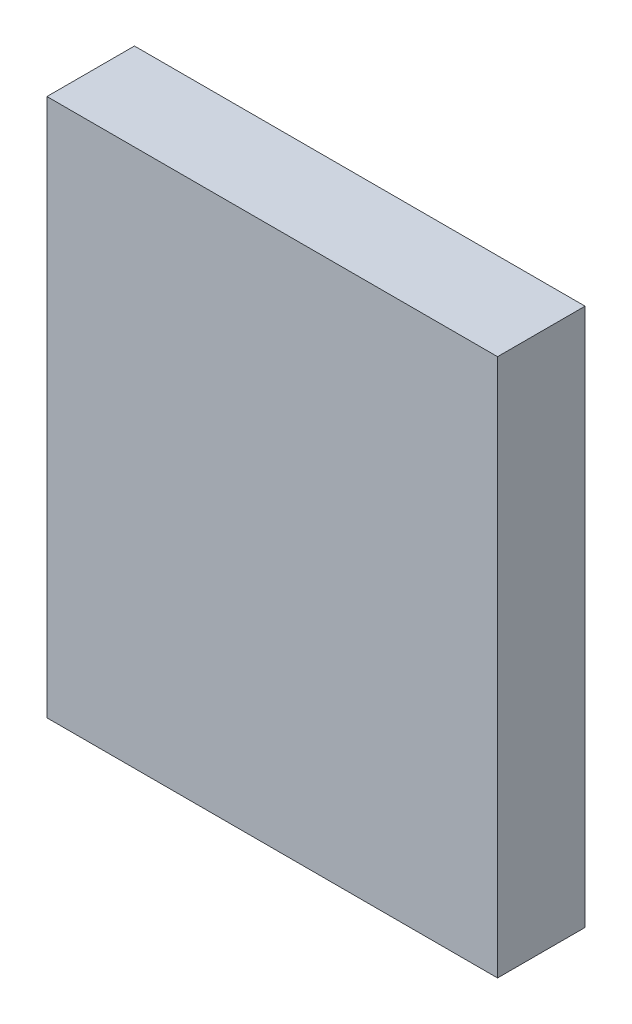
ISO-10303-21;
HEADER;
FILE_DESCRIPTION(('STEP AP214'),'2;1');
FILE_NAME('part.step','',(''),(''),'','','');
FILE_SCHEMA(('AUTOMOTIVE_DESIGN { 1 0 10303 214 1 1 1 1 }'));
ENDSEC;
DATA;
#1=APPLICATION_CONTEXT('core data for automotive mechanical design processes');
#2=APPLICATION_PROTOCOL_DEFINITION('international standard','automotive_design',2000,#1);
#3=PRODUCT_CONTEXT('',#1,'mechanical');
#4=PRODUCT('Part','Part','',(#3));
#5=PRODUCT_RELATED_PRODUCT_CATEGORY('part','',(#4));
#6=PRODUCT_DEFINITION_FORMATION('','',#4);
#7=PRODUCT_DEFINITION_CONTEXT('part definition',#1,'design');
#8=PRODUCT_DEFINITION('design','',#6,#7);
#9=PRODUCT_DEFINITION_SHAPE('','',#8);
#10=(LENGTH_UNIT() NAMED_UNIT(*) SI_UNIT(.MILLI.,.METRE.));
#11=(NAMED_UNIT(*) PLANE_ANGLE_UNIT() SI_UNIT($,.RADIAN.));
#12=(NAMED_UNIT(*) SI_UNIT($,.STERADIAN.) SOLID_ANGLE_UNIT());
#13=UNCERTAINTY_MEASURE_WITH_UNIT(LENGTH_MEASURE(1.E-05),#10,'distance_accuracy_value','');
#14=(GEOMETRIC_REPRESENTATION_CONTEXT(3) GLOBAL_UNCERTAINTY_ASSIGNED_CONTEXT((#13)) GLOBAL_UNIT_ASSIGNED_CONTEXT((#10,
#11,#12)) REPRESENTATION_CONTEXT('',''));
#15=CARTESIAN_POINT('',(0.,0.,0.));
#16=DIRECTION('',(0.,0.,1.));
#17=DIRECTION('',(1.,0.,0.));
#18=AXIS2_PLACEMENT_3D('',#15,#16,#17);
#19=CARTESIAN_POINT('',(-2.5750012,3.0750002,1.00000054));
#20=DIRECTION('',(0.,0.,-1.));
#21=DIRECTION('',(-1.,0.,0.));
#22=AXIS2_PLACEMENT_3D('',#19,#20,#21);
#23=PLANE('',#22);
#24=DIRECTION('',(1.,0.,0.));
#25=VECTOR('',#24,1.);
#26=CARTESIAN_POINT('',(-2.5750012,-3.0750002,1.00000054));
#27=LINE('',#26,#25);
#28=CARTESIAN_POINT('',(-2.5750012,-3.0750002,1.00000054));
#29=VERTEX_POINT('',#28);
#30=CARTESIAN_POINT('',(2.5750012,-3.0750002,1.00000054));
#31=VERTEX_POINT('',#30);
#32=EDGE_CURVE('E79',#29,#31,#27,.T.);
#33=ORIENTED_EDGE('',*,*,#32,.T.);
#34=DIRECTION('',(0.,1.,0.));
#35=VECTOR('',#34,1.);
#36=CARTESIAN_POINT('',(2.5750012,-3.0750002,1.00000054));
#37=LINE('',#36,#35);
#38=CARTESIAN_POINT('',(2.5750012,3.0750002,1.00000054));
#39=VERTEX_POINT('',#38);
#40=EDGE_CURVE('E55',#31,#39,#37,.T.);
#41=ORIENTED_EDGE('',*,*,#40,.T.);
#42=DIRECTION('',(1.,0.,0.));
#43=VECTOR('',#42,1.);
#44=CARTESIAN_POINT('',(2.5750012,3.0750002,1.00000054));
#45=LINE('',#44,#43);
#46=CARTESIAN_POINT('',(-2.5750012,3.0750002,1.00000054));
#47=VERTEX_POINT('',#46);
#48=EDGE_CURVE('E57',#39,#47,#45,.F.);
#49=ORIENTED_EDGE('',*,*,#48,.T.);
#50=DIRECTION('',(0.,1.,0.));
#51=VECTOR('',#50,1.);
#52=CARTESIAN_POINT('',(-2.5750012,3.0750002,1.00000054));
#53=LINE('',#52,#51);
#54=EDGE_CURVE('E20',#47,#29,#53,.F.);
#55=ORIENTED_EDGE('',*,*,#54,.T.);
#56=EDGE_LOOP('',(#33,#41,#49,#55));
#57=FACE_BOUND('',#56,.T.);
#58=ADVANCED_FACE('F17',(#57),#23,.F.);
#59=CARTESIAN_POINT('',(-2.5750012,3.0750002,0.));
#60=DIRECTION('',(1.,0.,0.));
#61=DIRECTION('',(0.,0.,-1.));
#62=AXIS2_PLACEMENT_3D('',#59,#60,#61);
#63=PLANE('',#62);
#64=DIRECTION('',(0.,1.,0.));
#65=VECTOR('',#64,1.);
#66=CARTESIAN_POINT('',(-2.5750012,3.0750002,0.));
#67=LINE('',#66,#65);
#68=CARTESIAN_POINT('',(-2.5750012,-3.0750002,0.));
#69=VERTEX_POINT('',#68);
#70=CARTESIAN_POINT('',(-2.5750012,3.0750002,0.));
#71=VERTEX_POINT('',#70);
#72=EDGE_CURVE('E83',#69,#71,#67,.T.);
#73=ORIENTED_EDGE('',*,*,#72,.F.);
#74=DIRECTION('',(0.,0.,1.));
#75=VECTOR('',#74,1.);
#76=CARTESIAN_POINT('',(-2.5750012,-3.0750002,0.));
#77=LINE('',#76,#75);
#78=EDGE_CURVE('E68',#69,#29,#77,.T.);
#79=ORIENTED_EDGE('',*,*,#78,.T.);
#80=ORIENTED_EDGE('',*,*,#54,.F.);
#81=DIRECTION('',(0.,0.,-1.));
#82=VECTOR('',#81,1.);
#83=CARTESIAN_POINT('',(-2.5750012,3.0750002,0.));
#84=LINE('',#83,#82);
#85=EDGE_CURVE('E63',#47,#71,#84,.T.);
#86=ORIENTED_EDGE('',*,*,#85,.T.);
#87=EDGE_LOOP('',(#73,#79,#80,#86));
#88=FACE_BOUND('',#87,.T.);
#89=ADVANCED_FACE('F65',(#88),#63,.F.);
#90=CARTESIAN_POINT('',(2.5750012,3.0750002,0.));
#91=DIRECTION('',(0.,-1.,0.));
#92=DIRECTION('',(0.,0.,-1.));
#93=AXIS2_PLACEMENT_3D('',#90,#91,#92);
#94=PLANE('',#93);
#95=DIRECTION('',(-1.,0.,0.));
#96=VECTOR('',#95,1.);
#97=CARTESIAN_POINT('',(-2.5750012,3.0750002,0.));
#98=LINE('',#97,#96);
#99=CARTESIAN_POINT('',(2.5750012,3.0750002,0.));
#100=VERTEX_POINT('',#99);
#101=EDGE_CURVE('E72',#71,#100,#98,.F.);
#102=ORIENTED_EDGE('',*,*,#101,.F.);
#103=ORIENTED_EDGE('',*,*,#85,.F.);
#104=ORIENTED_EDGE('',*,*,#48,.F.);
#105=DIRECTION('',(0.,0.,1.));
#106=VECTOR('',#105,1.);
#107=CARTESIAN_POINT('',(2.5750012,3.0750002,0.));
#108=LINE('',#107,#106);
#109=EDGE_CURVE('E75',#39,#100,#108,.F.);
#110=ORIENTED_EDGE('',*,*,#109,.T.);
#111=EDGE_LOOP('',(#102,#103,#104,#110));
#112=FACE_BOUND('',#111,.T.);
#113=ADVANCED_FACE('F70',(#112),#94,.F.);
#114=CARTESIAN_POINT('',(2.5750012,-3.0750002,0.));
#115=DIRECTION('',(-1.,0.,0.));
#116=DIRECTION('',(0.,0.,1.));
#117=AXIS2_PLACEMENT_3D('',#114,#115,#116);
#118=PLANE('',#117);
#119=DIRECTION('',(0.,1.,0.));
#120=VECTOR('',#119,1.);
#121=CARTESIAN_POINT('',(2.5750012,3.0750002,0.));
#122=LINE('',#121,#120);
#123=CARTESIAN_POINT('',(2.5750012,-3.0750002,0.));
#124=VERTEX_POINT('',#123);
#125=EDGE_CURVE('E26',#100,#124,#122,.F.);
#126=ORIENTED_EDGE('',*,*,#125,.F.);
#127=ORIENTED_EDGE('',*,*,#109,.F.);
#128=ORIENTED_EDGE('',*,*,#40,.F.);
#129=DIRECTION('',(0.,0.,1.));
#130=VECTOR('',#129,1.);
#131=CARTESIAN_POINT('',(2.5750012,-3.0750002,0.));
#132=LINE('',#131,#130);
#133=EDGE_CURVE('E35',#31,#124,#132,.F.);
#134=ORIENTED_EDGE('',*,*,#133,.T.);
#135=EDGE_LOOP('',(#126,#127,#128,#134));
#136=FACE_BOUND('',#135,.T.);
#137=ADVANCED_FACE('F89',(#136),#118,.F.);
#138=CARTESIAN_POINT('',(-2.5750012,-3.0750002,0.));
#139=DIRECTION('',(0.,1.,0.));
#140=DIRECTION('',(0.,0.,1.));
#141=AXIS2_PLACEMENT_3D('',#138,#139,#140);
#142=PLANE('',#141);
#143=DIRECTION('',(-1.,0.,0.));
#144=VECTOR('',#143,1.);
#145=CARTESIAN_POINT('',(-2.5750012,-3.0750002,0.));
#146=LINE('',#145,#144);
#147=EDGE_CURVE('E11',#124,#69,#146,.T.);
#148=ORIENTED_EDGE('',*,*,#147,.F.);
#149=ORIENTED_EDGE('',*,*,#133,.F.);
#150=ORIENTED_EDGE('',*,*,#32,.F.);
#151=ORIENTED_EDGE('',*,*,#78,.F.);
#152=EDGE_LOOP('',(#148,#149,#150,#151));
#153=FACE_BOUND('',#152,.T.);
#154=ADVANCED_FACE('F91',(#153),#142,.F.);
#155=CARTESIAN_POINT('',(-2.5750012,3.0750002,0.));
#156=DIRECTION('',(0.,0.,-1.));
#157=DIRECTION('',(-1.,0.,0.));
#158=AXIS2_PLACEMENT_3D('',#155,#156,#157);
#159=PLANE('',#158);
#160=ORIENTED_EDGE('',*,*,#125,.T.);
#161=ORIENTED_EDGE('',*,*,#147,.T.);
#162=ORIENTED_EDGE('',*,*,#72,.T.);
#163=ORIENTED_EDGE('',*,*,#101,.T.);
#164=EDGE_LOOP('',(#160,#161,#162,#163));
#165=FACE_BOUND('',#164,.T.);
#166=ADVANCED_FACE('F88',(#165),#159,.T.);
#167=CLOSED_SHELL('',(#58,#89,#113,#137,#154,#166));
#168=MANIFOLD_SOLID_BREP('B1',#167);
#169=ADVANCED_BREP_SHAPE_REPRESENTATION('',(#18,#168),#14);
#170=SHAPE_DEFINITION_REPRESENTATION(#9,#169);
ENDSEC;
END-ISO-10303-21;
